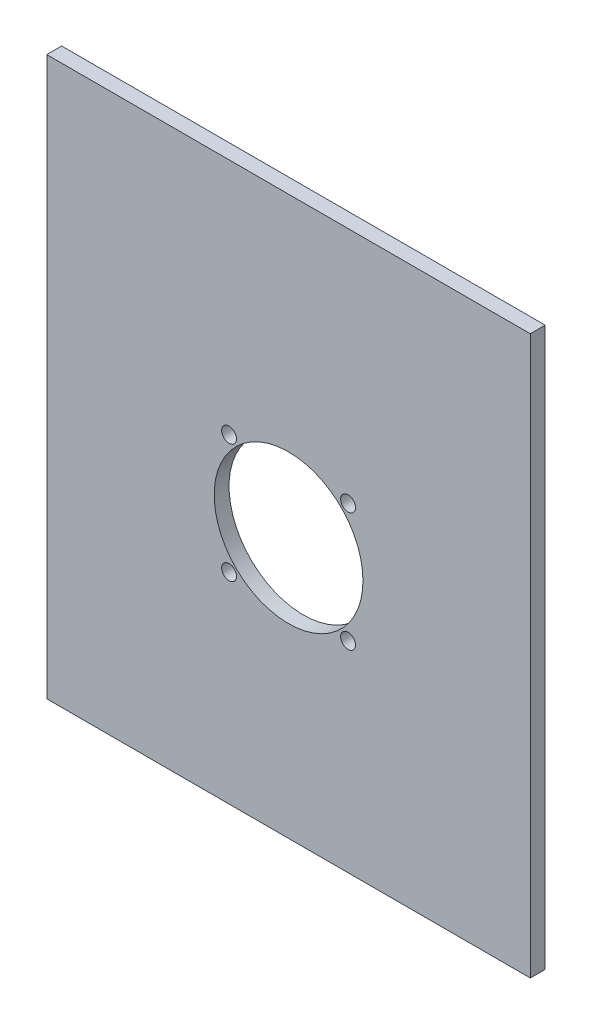
ISO-10303-21;
HEADER;
FILE_DESCRIPTION(('STEP AP214'),'2;1');
FILE_NAME('part.step','',(''),(''),'','','');
FILE_SCHEMA(('AUTOMOTIVE_DESIGN { 1 0 10303 214 1 1 1 1 }'));
ENDSEC;
DATA;
#1=APPLICATION_CONTEXT('core data for automotive mechanical design processes');
#2=APPLICATION_PROTOCOL_DEFINITION('international standard','automotive_design',2000,#1);
#3=PRODUCT_CONTEXT('',#1,'mechanical');
#4=PRODUCT('Part','Part','',(#3));
#5=PRODUCT_RELATED_PRODUCT_CATEGORY('part','',(#4));
#6=PRODUCT_DEFINITION_FORMATION('','',#4);
#7=PRODUCT_DEFINITION_CONTEXT('part definition',#1,'design');
#8=PRODUCT_DEFINITION('design','',#6,#7);
#9=PRODUCT_DEFINITION_SHAPE('','',#8);
#10=(LENGTH_UNIT() NAMED_UNIT(*) SI_UNIT(.MILLI.,.METRE.));
#11=(NAMED_UNIT(*) PLANE_ANGLE_UNIT() SI_UNIT($,.RADIAN.));
#12=(NAMED_UNIT(*) SI_UNIT($,.STERADIAN.) SOLID_ANGLE_UNIT());
#13=UNCERTAINTY_MEASURE_WITH_UNIT(LENGTH_MEASURE(1.E-05),#10,'distance_accuracy_value','');
#14=(GEOMETRIC_REPRESENTATION_CONTEXT(3) GLOBAL_UNCERTAINTY_ASSIGNED_CONTEXT((#13)) GLOBAL_UNIT_ASSIGNED_CONTEXT((#10,
#11,#12)) REPRESENTATION_CONTEXT('',''));
#15=CARTESIAN_POINT('',(0.,0.,0.));
#16=DIRECTION('',(0.,0.,1.));
#17=DIRECTION('',(1.,0.,0.));
#18=AXIS2_PLACEMENT_3D('',#15,#16,#17);
#19=CARTESIAN_POINT('',(-112.824675324675,64.3668831168831,4.));
#20=DIRECTION('',(1.,0.,0.));
#21=DIRECTION('',(0.,1.,0.));
#22=AXIS2_PLACEMENT_3D('',#19,#20,#21);
#23=PLANE('',#22);
#24=DIRECTION('',(0.,-1.,0.));
#25=VECTOR('',#24,1.);
#26=CARTESIAN_POINT('',(-112.824675324675,64.3668831168831,0.));
#27=LINE('',#26,#25);
#28=CARTESIAN_POINT('',(-112.824675324675,64.3668831168831,0.));
#29=VERTEX_POINT('',#28);
#30=CARTESIAN_POINT('',(-112.824675324675,-85.6331168831169,0.));
#31=VERTEX_POINT('',#30);
#32=EDGE_CURVE('E97',#29,#31,#27,.T.);
#33=ORIENTED_EDGE('',*,*,#32,.T.);
#34=DIRECTION('',(0.,0.,-1.));
#35=VECTOR('',#34,1.);
#36=CARTESIAN_POINT('',(-112.824675324675,-85.6331168831169,4.));
#37=LINE('',#36,#35);
#38=CARTESIAN_POINT('',(-112.824675324675,-85.6331168831169,4.));
#39=VERTEX_POINT('',#38);
#40=EDGE_CURVE('E11',#39,#31,#37,.T.);
#41=ORIENTED_EDGE('',*,*,#40,.F.);
#42=DIRECTION('',(0.,-1.,0.));
#43=VECTOR('',#42,1.);
#44=CARTESIAN_POINT('',(-112.824675324675,64.3668831168831,4.));
#45=LINE('',#44,#43);
#46=CARTESIAN_POINT('',(-112.824675324675,64.3668831168831,4.));
#47=VERTEX_POINT('',#46);
#48=EDGE_CURVE('E85',#47,#39,#45,.T.);
#49=ORIENTED_EDGE('',*,*,#48,.F.);
#50=DIRECTION('',(0.,0.,-1.));
#51=VECTOR('',#50,1.);
#52=CARTESIAN_POINT('',(-112.824675324675,64.3668831168831,4.));
#53=LINE('',#52,#51);
#54=EDGE_CURVE('E93',#47,#29,#53,.T.);
#55=ORIENTED_EDGE('',*,*,#54,.T.);
#56=EDGE_LOOP('',(#33,#41,#49,#55));
#57=FACE_BOUND('',#56,.T.);
#58=ADVANCED_FACE('F34',(#57),#23,.F.);
#59=CARTESIAN_POINT('',(-112.824675324675,-85.6331168831169,4.));
#60=DIRECTION('',(0.,1.,0.));
#61=DIRECTION('',(0.,0.,1.));
#62=AXIS2_PLACEMENT_3D('',#59,#60,#61);
#63=PLANE('',#62);
#64=DIRECTION('',(1.,0.,0.));
#65=VECTOR('',#64,1.);
#66=CARTESIAN_POINT('',(-112.824675324675,-85.6331168831169,0.));
#67=LINE('',#66,#65);
#68=CARTESIAN_POINT('',(17.1753246753247,-85.6331168831169,0.));
#69=VERTEX_POINT('',#68);
#70=EDGE_CURVE('E89',#31,#69,#67,.T.);
#71=ORIENTED_EDGE('',*,*,#70,.T.);
#72=DIRECTION('',(0.,0.,-1.));
#73=VECTOR('',#72,1.);
#74=CARTESIAN_POINT('',(17.1753246753247,-85.6331168831169,4.));
#75=LINE('',#74,#73);
#76=CARTESIAN_POINT('',(17.1753246753247,-85.6331168831169,4.));
#77=VERTEX_POINT('',#76);
#78=EDGE_CURVE('E42',#77,#69,#75,.T.);
#79=ORIENTED_EDGE('',*,*,#78,.F.);
#80=DIRECTION('',(1.,0.,0.));
#81=VECTOR('',#80,1.);
#82=CARTESIAN_POINT('',(-112.824675324675,-85.6331168831169,4.));
#83=LINE('',#82,#81);
#84=EDGE_CURVE('E80',#39,#77,#83,.T.);
#85=ORIENTED_EDGE('',*,*,#84,.F.);
#86=ORIENTED_EDGE('',*,*,#40,.T.);
#87=EDGE_LOOP('',(#71,#79,#85,#86));
#88=FACE_BOUND('',#87,.T.);
#89=ADVANCED_FACE('F88',(#88),#63,.F.);
#90=CARTESIAN_POINT('',(17.1753246753246,64.3668831168831,4.));
#91=DIRECTION('',(-1.,0.,0.));
#92=DIRECTION('',(0.,-1.,0.));
#93=AXIS2_PLACEMENT_3D('',#90,#91,#92);
#94=PLANE('',#93);
#95=DIRECTION('',(0.,1.,0.));
#96=VECTOR('',#95,1.);
#97=CARTESIAN_POINT('',(17.1753246753246,64.3668831168831,0.));
#98=LINE('',#97,#96);
#99=CARTESIAN_POINT('',(17.1753246753246,64.3668831168831,0.));
#100=VERTEX_POINT('',#99);
#101=EDGE_CURVE('E67',#69,#100,#98,.T.);
#102=ORIENTED_EDGE('',*,*,#101,.T.);
#103=DIRECTION('',(0.,0.,-1.));
#104=VECTOR('',#103,1.);
#105=CARTESIAN_POINT('',(17.1753246753246,64.3668831168831,4.));
#106=LINE('',#105,#104);
#107=CARTESIAN_POINT('',(17.1753246753246,64.3668831168831,4.));
#108=VERTEX_POINT('',#107);
#109=EDGE_CURVE('E90',#108,#100,#106,.T.);
#110=ORIENTED_EDGE('',*,*,#109,.F.);
#111=DIRECTION('',(0.,1.,0.));
#112=VECTOR('',#111,1.);
#113=CARTESIAN_POINT('',(17.1753246753246,64.3668831168831,4.));
#114=LINE('',#113,#112);
#115=EDGE_CURVE('E83',#77,#108,#114,.T.);
#116=ORIENTED_EDGE('',*,*,#115,.F.);
#117=ORIENTED_EDGE('',*,*,#78,.T.);
#118=EDGE_LOOP('',(#102,#110,#116,#117));
#119=FACE_BOUND('',#118,.T.);
#120=ADVANCED_FACE('F91',(#119),#94,.F.);
#121=CARTESIAN_POINT('',(-112.824675324675,64.3668831168831,4.));
#122=DIRECTION('',(0.,-1.,0.));
#123=DIRECTION('',(0.,0.,-1.));
#124=AXIS2_PLACEMENT_3D('',#121,#122,#123);
#125=PLANE('',#124);
#126=DIRECTION('',(-1.,0.,0.));
#127=VECTOR('',#126,1.);
#128=CARTESIAN_POINT('',(-112.824675324675,64.3668831168831,0.));
#129=LINE('',#128,#127);
#130=EDGE_CURVE('E73',#100,#29,#129,.T.);
#131=ORIENTED_EDGE('',*,*,#130,.T.);
#132=ORIENTED_EDGE('',*,*,#54,.F.);
#133=DIRECTION('',(-1.,0.,0.));
#134=VECTOR('',#133,1.);
#135=CARTESIAN_POINT('',(-112.824675324675,64.3668831168831,4.));
#136=LINE('',#135,#134);
#137=EDGE_CURVE('E50',#108,#47,#136,.T.);
#138=ORIENTED_EDGE('',*,*,#137,.F.);
#139=ORIENTED_EDGE('',*,*,#109,.T.);
#140=EDGE_LOOP('',(#131,#132,#138,#139));
#141=FACE_BOUND('',#140,.T.);
#142=ADVANCED_FACE('F105',(#141),#125,.F.);
#143=CARTESIAN_POINT('',(0.,0.,4.));
#144=DIRECTION('',(0.,0.,1.));
#145=DIRECTION('',(1.,0.,0.));
#146=AXIS2_PLACEMENT_3D('',#143,#144,#145);
#147=PLANE('',#146);
#148=CARTESIAN_POINT('',(-31.8246753246753,0.36688311688312,4.));
#149=DIRECTION('',(0.,0.,1.));
#150=DIRECTION('',(1.,0.,0.));
#151=AXIS2_PLACEMENT_3D('',#148,#149,#150);
#152=CIRCLE('',#151,2.);
#153=CARTESIAN_POINT('',(-29.8246753246753,0.36688311688312,4.));
#154=VERTEX_POINT('',#153);
#155=EDGE_CURVE('E126',#154,#154,#152,.T.);
#156=ORIENTED_EDGE('',*,*,#155,.F.);
#157=EDGE_LOOP('',(#156));
#158=FACE_BOUND('',#157,.T.);
#159=CARTESIAN_POINT('',(-31.8246753246753,-31.6331168831169,4.));
#160=DIRECTION('',(0.,0.,1.));
#161=DIRECTION('',(1.,0.,0.));
#162=AXIS2_PLACEMENT_3D('',#159,#160,#161);
#163=CIRCLE('',#162,2.);
#164=CARTESIAN_POINT('',(-29.8246753246753,-31.6331168831169,4.));
#165=VERTEX_POINT('',#164);
#166=EDGE_CURVE('E132',#165,#165,#163,.T.);
#167=ORIENTED_EDGE('',*,*,#166,.F.);
#168=EDGE_LOOP('',(#167));
#169=FACE_BOUND('',#168,.T.);
#170=CARTESIAN_POINT('',(-63.8246753246753,-31.6331168831169,4.));
#171=DIRECTION('',(0.,0.,1.));
#172=DIRECTION('',(1.,0.,0.));
#173=AXIS2_PLACEMENT_3D('',#170,#171,#172);
#174=CIRCLE('',#173,2.);
#175=CARTESIAN_POINT('',(-61.8246753246753,-31.6331168831169,4.));
#176=VERTEX_POINT('',#175);
#177=EDGE_CURVE('E120',#176,#176,#174,.T.);
#178=ORIENTED_EDGE('',*,*,#177,.F.);
#179=EDGE_LOOP('',(#178));
#180=FACE_BOUND('',#179,.T.);
#181=CARTESIAN_POINT('',(-63.8246753246754,0.366883116883123,4.));
#182=DIRECTION('',(0.,0.,1.));
#183=DIRECTION('',(1.,0.,0.));
#184=AXIS2_PLACEMENT_3D('',#181,#182,#183);
#185=CIRCLE('',#184,2.);
#186=CARTESIAN_POINT('',(-61.8246753246754,0.366883116883123,4.));
#187=VERTEX_POINT('',#186);
#188=EDGE_CURVE('E117',#187,#187,#185,.T.);
#189=ORIENTED_EDGE('',*,*,#188,.F.);
#190=EDGE_LOOP('',(#189));
#191=FACE_BOUND('',#190,.T.);
#192=CARTESIAN_POINT('',(-47.8246753246753,-15.6331168831169,4.));
#193=DIRECTION('',(0.,0.,1.));
#194=DIRECTION('',(1.,0.,0.));
#195=AXIS2_PLACEMENT_3D('',#192,#193,#194);
#196=CIRCLE('',#195,20.);
#197=CARTESIAN_POINT('',(-27.8246753246753,-15.6331168831169,4.));
#198=VERTEX_POINT('',#197);
#199=EDGE_CURVE('E111',#198,#198,#196,.T.);
#200=ORIENTED_EDGE('',*,*,#199,.F.);
#201=EDGE_LOOP('',(#200));
#202=FACE_BOUND('',#201,.T.);
#203=ORIENTED_EDGE('',*,*,#48,.T.);
#204=ORIENTED_EDGE('',*,*,#84,.T.);
#205=ORIENTED_EDGE('',*,*,#115,.T.);
#206=ORIENTED_EDGE('',*,*,#137,.T.);
#207=EDGE_LOOP('',(#203,#204,#205,#206));
#208=FACE_BOUND('',#207,.T.);
#209=ADVANCED_FACE('F81',(#158,#169,#180,#191,#202,#208),#147,.T.);
#210=CARTESIAN_POINT('',(0.,0.,0.));
#211=DIRECTION('',(0.,0.,1.));
#212=DIRECTION('',(1.,0.,0.));
#213=AXIS2_PLACEMENT_3D('',#210,#211,#212);
#214=PLANE('',#213);
#215=CARTESIAN_POINT('',(-31.8246753246753,0.36688311688312,0.));
#216=DIRECTION('',(0.,0.,1.));
#217=DIRECTION('',(1.,0.,0.));
#218=AXIS2_PLACEMENT_3D('',#215,#216,#217);
#219=CIRCLE('',#218,2.);
#220=CARTESIAN_POINT('',(-29.8246753246753,0.36688311688312,0.));
#221=VERTEX_POINT('',#220);
#222=EDGE_CURVE('E123',#221,#221,#219,.T.);
#223=ORIENTED_EDGE('',*,*,#222,.T.);
#224=EDGE_LOOP('',(#223));
#225=FACE_BOUND('',#224,.T.);
#226=CARTESIAN_POINT('',(-31.8246753246753,-31.6331168831169,0.));
#227=DIRECTION('',(0.,0.,1.));
#228=DIRECTION('',(1.,0.,0.));
#229=AXIS2_PLACEMENT_3D('',#226,#227,#228);
#230=CIRCLE('',#229,2.);
#231=CARTESIAN_POINT('',(-29.8246753246753,-31.6331168831169,0.));
#232=VERTEX_POINT('',#231);
#233=EDGE_CURVE('E129',#232,#232,#230,.T.);
#234=ORIENTED_EDGE('',*,*,#233,.T.);
#235=EDGE_LOOP('',(#234));
#236=FACE_BOUND('',#235,.T.);
#237=CARTESIAN_POINT('',(-63.8246753246753,-31.6331168831169,0.));
#238=DIRECTION('',(0.,0.,1.));
#239=DIRECTION('',(1.,0.,0.));
#240=AXIS2_PLACEMENT_3D('',#237,#238,#239);
#241=CIRCLE('',#240,2.);
#242=CARTESIAN_POINT('',(-61.8246753246753,-31.6331168831169,0.));
#243=VERTEX_POINT('',#242);
#244=EDGE_CURVE('E135',#243,#243,#241,.T.);
#245=ORIENTED_EDGE('',*,*,#244,.T.);
#246=EDGE_LOOP('',(#245));
#247=FACE_BOUND('',#246,.T.);
#248=CARTESIAN_POINT('',(-63.8246753246754,0.366883116883123,0.));
#249=DIRECTION('',(0.,0.,1.));
#250=DIRECTION('',(1.,0.,0.));
#251=AXIS2_PLACEMENT_3D('',#248,#249,#250);
#252=CIRCLE('',#251,2.);
#253=CARTESIAN_POINT('',(-61.8246753246754,0.366883116883123,0.));
#254=VERTEX_POINT('',#253);
#255=EDGE_CURVE('E114',#254,#254,#252,.T.);
#256=ORIENTED_EDGE('',*,*,#255,.T.);
#257=EDGE_LOOP('',(#256));
#258=FACE_BOUND('',#257,.T.);
#259=CARTESIAN_POINT('',(-47.8246753246753,-15.6331168831169,0.));
#260=DIRECTION('',(0.,0.,1.));
#261=DIRECTION('',(1.,0.,0.));
#262=AXIS2_PLACEMENT_3D('',#259,#260,#261);
#263=CIRCLE('',#262,20.);
#264=CARTESIAN_POINT('',(-27.8246753246753,-15.6331168831169,0.));
#265=VERTEX_POINT('',#264);
#266=EDGE_CURVE('E100',#265,#265,#263,.T.);
#267=ORIENTED_EDGE('',*,*,#266,.T.);
#268=EDGE_LOOP('',(#267));
#269=FACE_BOUND('',#268,.T.);
#270=ORIENTED_EDGE('',*,*,#32,.F.);
#271=ORIENTED_EDGE('',*,*,#130,.F.);
#272=ORIENTED_EDGE('',*,*,#101,.F.);
#273=ORIENTED_EDGE('',*,*,#70,.F.);
#274=EDGE_LOOP('',(#270,#271,#272,#273));
#275=FACE_BOUND('',#274,.T.);
#276=ADVANCED_FACE('F108',(#225,#236,#247,#258,#269,#275),#214,.F.);
#277=CARTESIAN_POINT('',(-47.8246753246753,-15.6331168831169,0.));
#278=DIRECTION('',(0.,0.,1.));
#279=DIRECTION('',(1.,0.,0.));
#280=AXIS2_PLACEMENT_3D('',#277,#278,#279);
#281=CYLINDRICAL_SURFACE('',#280,20.);
#282=ORIENTED_EDGE('',*,*,#266,.F.);
#283=EDGE_LOOP('',(#282));
#284=FACE_BOUND('',#283,.T.);
#285=ORIENTED_EDGE('',*,*,#199,.T.);
#286=EDGE_LOOP('',(#285));
#287=FACE_BOUND('',#286,.T.);
#288=ADVANCED_FACE('F151',(#284,#287),#281,.F.);
#289=CARTESIAN_POINT('',(-63.8246753246754,0.366883116883123,0.));
#290=DIRECTION('',(0.,0.,1.));
#291=DIRECTION('',(1.,0.,0.));
#292=AXIS2_PLACEMENT_3D('',#289,#290,#291);
#293=CYLINDRICAL_SURFACE('',#292,2.);
#294=ORIENTED_EDGE('',*,*,#255,.F.);
#295=EDGE_LOOP('',(#294));
#296=FACE_BOUND('',#295,.T.);
#297=ORIENTED_EDGE('',*,*,#188,.T.);
#298=EDGE_LOOP('',(#297));
#299=FACE_BOUND('',#298,.T.);
#300=ADVANCED_FACE('F153',(#296,#299),#293,.F.);
#301=CARTESIAN_POINT('',(-63.8246753246753,-31.6331168831169,0.));
#302=DIRECTION('',(0.,0.,1.));
#303=DIRECTION('',(1.,0.,0.));
#304=AXIS2_PLACEMENT_3D('',#301,#302,#303);
#305=CYLINDRICAL_SURFACE('',#304,2.);
#306=ORIENTED_EDGE('',*,*,#244,.F.);
#307=EDGE_LOOP('',(#306));
#308=FACE_BOUND('',#307,.T.);
#309=ORIENTED_EDGE('',*,*,#177,.T.);
#310=EDGE_LOOP('',(#309));
#311=FACE_BOUND('',#310,.T.);
#312=ADVANCED_FACE('F141',(#308,#311),#305,.F.);
#313=CARTESIAN_POINT('',(-31.8246753246753,-31.6331168831169,0.));
#314=DIRECTION('',(0.,0.,1.));
#315=DIRECTION('',(1.,0.,0.));
#316=AXIS2_PLACEMENT_3D('',#313,#314,#315);
#317=CYLINDRICAL_SURFACE('',#316,2.);
#318=ORIENTED_EDGE('',*,*,#233,.F.);
#319=EDGE_LOOP('',(#318));
#320=FACE_BOUND('',#319,.T.);
#321=ORIENTED_EDGE('',*,*,#166,.T.);
#322=EDGE_LOOP('',(#321));
#323=FACE_BOUND('',#322,.T.);
#324=ADVANCED_FACE('F205',(#320,#323),#317,.F.);
#325=CARTESIAN_POINT('',(-31.8246753246753,0.36688311688312,0.));
#326=DIRECTION('',(0.,0.,1.));
#327=DIRECTION('',(1.,0.,0.));
#328=AXIS2_PLACEMENT_3D('',#325,#326,#327);
#329=CYLINDRICAL_SURFACE('',#328,2.);
#330=ORIENTED_EDGE('',*,*,#222,.F.);
#331=EDGE_LOOP('',(#330));
#332=FACE_BOUND('',#331,.T.);
#333=ORIENTED_EDGE('',*,*,#155,.T.);
#334=EDGE_LOOP('',(#333));
#335=FACE_BOUND('',#334,.T.);
#336=ADVANCED_FACE('F215',(#332,#335),#329,.F.);
#337=CLOSED_SHELL('',(#58,#89,#120,#142,#209,#276,#288,#300,#312,#324,#336));
#338=MANIFOLD_SOLID_BREP('B2',#337);
#339=ADVANCED_BREP_SHAPE_REPRESENTATION('',(#18,#338),#14);
#340=SHAPE_DEFINITION_REPRESENTATION(#9,#339);
ENDSEC;
END-ISO-10303-21;
